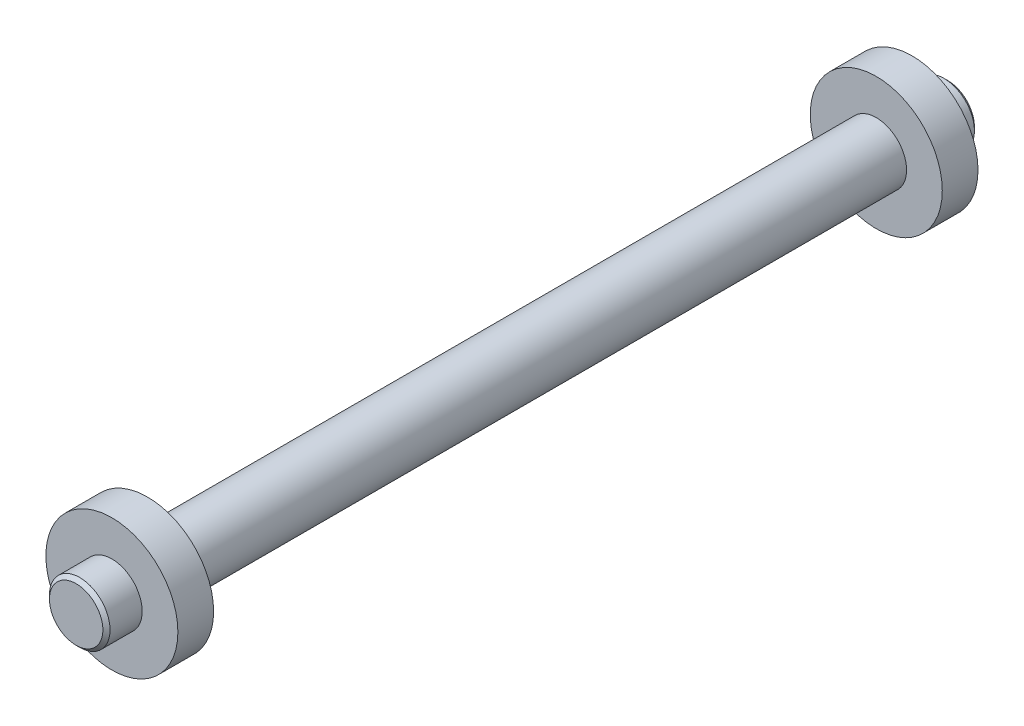
ISO-10303-21;
HEADER;
FILE_DESCRIPTION(('STEP AP214'),'2;1');
FILE_NAME('part.step','',(''),(''),'','','');
FILE_SCHEMA(('AUTOMOTIVE_DESIGN { 1 0 10303 214 1 1 1 1 }'));
ENDSEC;
DATA;
#1=APPLICATION_CONTEXT('core data for automotive mechanical design processes');
#2=APPLICATION_PROTOCOL_DEFINITION('international standard','automotive_design',2000,#1);
#3=PRODUCT_CONTEXT('',#1,'mechanical');
#4=PRODUCT('Part','Part','',(#3));
#5=PRODUCT_RELATED_PRODUCT_CATEGORY('part','',(#4));
#6=PRODUCT_DEFINITION_FORMATION('','',#4);
#7=PRODUCT_DEFINITION_CONTEXT('part definition',#1,'design');
#8=PRODUCT_DEFINITION('design','',#6,#7);
#9=PRODUCT_DEFINITION_SHAPE('','',#8);
#10=(LENGTH_UNIT() NAMED_UNIT(*) SI_UNIT(.MILLI.,.METRE.));
#11=(NAMED_UNIT(*) PLANE_ANGLE_UNIT() SI_UNIT($,.RADIAN.));
#12=(NAMED_UNIT(*) SI_UNIT($,.STERADIAN.) SOLID_ANGLE_UNIT());
#13=UNCERTAINTY_MEASURE_WITH_UNIT(LENGTH_MEASURE(1.E-05),#10,'distance_accuracy_value','');
#14=(GEOMETRIC_REPRESENTATION_CONTEXT(3) GLOBAL_UNCERTAINTY_ASSIGNED_CONTEXT((#13)) GLOBAL_UNIT_ASSIGNED_CONTEXT((#10,
#11,#12)) REPRESENTATION_CONTEXT('',''));
#15=CARTESIAN_POINT('',(0.,0.,0.));
#16=DIRECTION('',(0.,0.,1.));
#17=DIRECTION('',(1.,0.,0.));
#18=AXIS2_PLACEMENT_3D('',#15,#16,#17);
#19=CARTESIAN_POINT('',(0.,1.06,15.25));
#20=DIRECTION('',(0.,0.,-1.));
#21=DIRECTION('',(-1.,0.,0.));
#22=AXIS2_PLACEMENT_3D('',#19,#20,#21);
#23=PLANE('',#22);
#24=CARTESIAN_POINT('',(0.,0.,15.25));
#25=DIRECTION('',(0.,0.,-1.));
#26=DIRECTION('',(-1.,0.,0.));
#27=AXIS2_PLACEMENT_3D('',#24,#25,#26);
#28=CIRCLE('',#27,0.934999999999998);
#29=CARTESIAN_POINT('',(-0.934999999999998,0.,15.25));
#30=VERTEX_POINT('',#29);
#31=EDGE_CURVE('E36',#30,#30,#28,.F.);
#32=ORIENTED_EDGE('',*,*,#31,.T.);
#33=EDGE_LOOP('',(#32));
#34=FACE_BOUND('',#33,.T.);
#35=ADVANCED_FACE('F29',(#34),#23,.F.);
#36=CARTESIAN_POINT('',(0.,0.,-15.25));
#37=DIRECTION('',(0.,0.,1.));
#38=DIRECTION('',(1.,0.,0.));
#39=AXIS2_PLACEMENT_3D('',#36,#37,#38);
#40=PLANE('',#39);
#41=CARTESIAN_POINT('',(0.,0.,-15.25));
#42=DIRECTION('',(0.,0.,1.));
#43=DIRECTION('',(1.,0.,0.));
#44=AXIS2_PLACEMENT_3D('',#41,#42,#43);
#45=CIRCLE('',#44,0.934999999999995);
#46=CARTESIAN_POINT('',(0.934999999999995,0.,-15.25));
#47=VERTEX_POINT('',#46);
#48=EDGE_CURVE('E40',#47,#47,#45,.F.);
#49=ORIENTED_EDGE('',*,*,#48,.T.);
#50=EDGE_LOOP('',(#49));
#51=FACE_BOUND('',#50,.T.);
#52=ADVANCED_FACE('F120',(#51),#40,.F.);
#53=CARTESIAN_POINT('',(0.,0.,15.25));
#54=DIRECTION('',(0.,0.,1.));
#55=DIRECTION('',(1.,0.,0.));
#56=AXIS2_PLACEMENT_3D('',#53,#54,#55);
#57=CYLINDRICAL_SURFACE('',#56,1.06);
#58=CARTESIAN_POINT('',(0.,0.,-15.125));
#59=DIRECTION('',(0.,0.,1.));
#60=DIRECTION('',(1.,0.,0.));
#61=AXIS2_PLACEMENT_3D('',#58,#59,#60);
#62=CIRCLE('',#61,1.06);
#63=CARTESIAN_POINT('',(1.06,0.,-15.125));
#64=VERTEX_POINT('',#63);
#65=EDGE_CURVE('E44',#64,#64,#62,.T.);
#66=ORIENTED_EDGE('',*,*,#65,.T.);
#67=EDGE_LOOP('',(#66));
#68=FACE_BOUND('',#67,.T.);
#69=CARTESIAN_POINT('',(0.,0.,-14.));
#70=DIRECTION('',(0.,0.,1.));
#71=DIRECTION('',(1.,0.,0.));
#72=AXIS2_PLACEMENT_3D('',#69,#70,#71);
#73=CIRCLE('',#72,1.06);
#74=CARTESIAN_POINT('',(1.06,0.,-14.));
#75=VERTEX_POINT('',#74);
#76=EDGE_CURVE('E49',#75,#75,#73,.T.);
#77=ORIENTED_EDGE('',*,*,#76,.F.);
#78=EDGE_LOOP('',(#77));
#79=FACE_BOUND('',#78,.T.);
#80=ADVANCED_FACE('F115',(#68,#79),#57,.T.);
#81=CARTESIAN_POINT('',(0.,1.06,-14.));
#82=DIRECTION('',(0.,0.,1.));
#83=DIRECTION('',(1.,0.,0.));
#84=AXIS2_PLACEMENT_3D('',#81,#82,#83);
#85=PLANE('',#84);
#86=CARTESIAN_POINT('',(0.,0.,-14.));
#87=DIRECTION('',(0.,0.,1.));
#88=DIRECTION('',(1.,0.,0.));
#89=AXIS2_PLACEMENT_3D('',#86,#87,#88);
#90=CIRCLE('',#89,2.31);
#91=CARTESIAN_POINT('',(2.31,0.,-14.));
#92=VERTEX_POINT('',#91);
#93=EDGE_CURVE('E52',#92,#92,#90,.T.);
#94=ORIENTED_EDGE('',*,*,#93,.F.);
#95=EDGE_LOOP('',(#94));
#96=FACE_BOUND('',#95,.T.);
#97=ORIENTED_EDGE('',*,*,#76,.T.);
#98=EDGE_LOOP('',(#97));
#99=FACE_BOUND('',#98,.T.);
#100=ADVANCED_FACE('F109',(#96,#99),#85,.F.);
#101=CARTESIAN_POINT('',(0.,0.,15.25));
#102=DIRECTION('',(0.,0.,1.));
#103=DIRECTION('',(1.,0.,0.));
#104=AXIS2_PLACEMENT_3D('',#101,#102,#103);
#105=CYLINDRICAL_SURFACE('',#104,2.31);
#106=CARTESIAN_POINT('',(0.,0.,-12.75));
#107=DIRECTION('',(0.,0.,1.));
#108=DIRECTION('',(1.,0.,0.));
#109=AXIS2_PLACEMENT_3D('',#106,#107,#108);
#110=CIRCLE('',#109,2.31);
#111=CARTESIAN_POINT('',(2.31,0.,-12.75));
#112=VERTEX_POINT('',#111);
#113=EDGE_CURVE('E55',#112,#112,#110,.T.);
#114=ORIENTED_EDGE('',*,*,#113,.F.);
#115=EDGE_LOOP('',(#114));
#116=FACE_BOUND('',#115,.T.);
#117=ORIENTED_EDGE('',*,*,#93,.T.);
#118=EDGE_LOOP('',(#117));
#119=FACE_BOUND('',#118,.T.);
#120=ADVANCED_FACE('F103',(#116,#119),#105,.T.);
#121=CARTESIAN_POINT('',(0.,2.30999999999999,-12.75));
#122=DIRECTION('',(0.,0.,-1.));
#123=DIRECTION('',(-1.,0.,0.));
#124=AXIS2_PLACEMENT_3D('',#121,#122,#123);
#125=PLANE('',#124);
#126=CARTESIAN_POINT('',(0.,0.,-12.75));
#127=DIRECTION('',(0.,0.,1.));
#128=DIRECTION('',(1.,0.,0.));
#129=AXIS2_PLACEMENT_3D('',#126,#127,#128);
#130=CIRCLE('',#129,1.06);
#131=CARTESIAN_POINT('',(1.06,0.,-12.75));
#132=VERTEX_POINT('',#131);
#133=EDGE_CURVE('E58',#132,#132,#130,.T.);
#134=ORIENTED_EDGE('',*,*,#133,.F.);
#135=EDGE_LOOP('',(#134));
#136=FACE_BOUND('',#135,.T.);
#137=ORIENTED_EDGE('',*,*,#113,.T.);
#138=EDGE_LOOP('',(#137));
#139=FACE_BOUND('',#138,.T.);
#140=ADVANCED_FACE('F97',(#136,#139),#125,.F.);
#141=CARTESIAN_POINT('',(0.,0.,15.25));
#142=DIRECTION('',(0.,0.,1.));
#143=DIRECTION('',(1.,0.,0.));
#144=AXIS2_PLACEMENT_3D('',#141,#142,#143);
#145=CYLINDRICAL_SURFACE('',#144,1.06);
#146=CARTESIAN_POINT('',(0.,0.,12.75));
#147=DIRECTION('',(0.,0.,1.));
#148=DIRECTION('',(1.,0.,0.));
#149=AXIS2_PLACEMENT_3D('',#146,#147,#148);
#150=CIRCLE('',#149,1.06);
#151=CARTESIAN_POINT('',(1.06,0.,12.75));
#152=VERTEX_POINT('',#151);
#153=EDGE_CURVE('E61',#152,#152,#150,.T.);
#154=ORIENTED_EDGE('',*,*,#153,.F.);
#155=EDGE_LOOP('',(#154));
#156=FACE_BOUND('',#155,.T.);
#157=ORIENTED_EDGE('',*,*,#133,.T.);
#158=EDGE_LOOP('',(#157));
#159=FACE_BOUND('',#158,.T.);
#160=ADVANCED_FACE('F91',(#156,#159),#145,.T.);
#161=CARTESIAN_POINT('',(0.,1.06,12.75));
#162=DIRECTION('',(0.,0.,1.));
#163=DIRECTION('',(1.,0.,0.));
#164=AXIS2_PLACEMENT_3D('',#161,#162,#163);
#165=PLANE('',#164);
#166=CARTESIAN_POINT('',(0.,0.,12.75));
#167=DIRECTION('',(0.,0.,1.));
#168=DIRECTION('',(1.,0.,0.));
#169=AXIS2_PLACEMENT_3D('',#166,#167,#168);
#170=CIRCLE('',#169,2.31);
#171=CARTESIAN_POINT('',(2.31,0.,12.75));
#172=VERTEX_POINT('',#171);
#173=EDGE_CURVE('E64',#172,#172,#170,.T.);
#174=ORIENTED_EDGE('',*,*,#173,.F.);
#175=EDGE_LOOP('',(#174));
#176=FACE_BOUND('',#175,.T.);
#177=ORIENTED_EDGE('',*,*,#153,.T.);
#178=EDGE_LOOP('',(#177));
#179=FACE_BOUND('',#178,.T.);
#180=ADVANCED_FACE('F85',(#176,#179),#165,.F.);
#181=CARTESIAN_POINT('',(0.,0.,15.25));
#182=DIRECTION('',(0.,0.,1.));
#183=DIRECTION('',(1.,0.,0.));
#184=AXIS2_PLACEMENT_3D('',#181,#182,#183);
#185=CYLINDRICAL_SURFACE('',#184,2.31);
#186=CARTESIAN_POINT('',(0.,0.,14.));
#187=DIRECTION('',(0.,0.,1.));
#188=DIRECTION('',(1.,0.,0.));
#189=AXIS2_PLACEMENT_3D('',#186,#187,#188);
#190=CIRCLE('',#189,2.31);
#191=CARTESIAN_POINT('',(2.31,0.,14.));
#192=VERTEX_POINT('',#191);
#193=EDGE_CURVE('E67',#192,#192,#190,.T.);
#194=ORIENTED_EDGE('',*,*,#193,.F.);
#195=EDGE_LOOP('',(#194));
#196=FACE_BOUND('',#195,.T.);
#197=ORIENTED_EDGE('',*,*,#173,.T.);
#198=EDGE_LOOP('',(#197));
#199=FACE_BOUND('',#198,.T.);
#200=ADVANCED_FACE('F79',(#196,#199),#185,.T.);
#201=CARTESIAN_POINT('',(0.,2.31,14.));
#202=DIRECTION('',(0.,0.,-1.));
#203=DIRECTION('',(-1.,0.,0.));
#204=AXIS2_PLACEMENT_3D('',#201,#202,#203);
#205=PLANE('',#204);
#206=CARTESIAN_POINT('',(0.,0.,14.));
#207=DIRECTION('',(0.,0.,1.));
#208=DIRECTION('',(1.,0.,0.));
#209=AXIS2_PLACEMENT_3D('',#206,#207,#208);
#210=CIRCLE('',#209,1.06);
#211=CARTESIAN_POINT('',(1.06,0.,14.));
#212=VERTEX_POINT('',#211);
#213=EDGE_CURVE('E70',#212,#212,#210,.T.);
#214=ORIENTED_EDGE('',*,*,#213,.F.);
#215=EDGE_LOOP('',(#214));
#216=FACE_BOUND('',#215,.T.);
#217=ORIENTED_EDGE('',*,*,#193,.T.);
#218=EDGE_LOOP('',(#217));
#219=FACE_BOUND('',#218,.T.);
#220=ADVANCED_FACE('F76',(#216,#219),#205,.F.);
#221=CARTESIAN_POINT('',(0.,0.,15.25));
#222=DIRECTION('',(0.,0.,1.));
#223=DIRECTION('',(1.,0.,0.));
#224=AXIS2_PLACEMENT_3D('',#221,#222,#223);
#225=CYLINDRICAL_SURFACE('',#224,1.06);
#226=CARTESIAN_POINT('',(0.,0.,15.125));
#227=DIRECTION('',(0.,0.,-1.));
#228=DIRECTION('',(-1.,0.,0.));
#229=AXIS2_PLACEMENT_3D('',#226,#227,#228);
#230=CIRCLE('',#229,1.06);
#231=CARTESIAN_POINT('',(-1.06,0.,15.125));
#232=VERTEX_POINT('',#231);
#233=EDGE_CURVE('E10',#232,#232,#230,.T.);
#234=ORIENTED_EDGE('',*,*,#233,.T.);
#235=EDGE_LOOP('',(#234));
#236=FACE_BOUND('',#235,.T.);
#237=ORIENTED_EDGE('',*,*,#213,.T.);
#238=EDGE_LOOP('',(#237));
#239=FACE_BOUND('',#238,.T.);
#240=ADVANCED_FACE('F74',(#236,#239),#225,.T.);
#241=CARTESIAN_POINT('',(0.,0.,-15.125));
#242=DIRECTION('',(0.,0.,1.));
#243=DIRECTION('',(1.,0.,0.));
#244=AXIS2_PLACEMENT_3D('',#241,#242,#243);
#245=CONICAL_SURFACE('',#244,1.06,0.785398163397445);
#246=ORIENTED_EDGE('',*,*,#48,.F.);
#247=EDGE_LOOP('',(#246));
#248=FACE_BOUND('',#247,.T.);
#249=ORIENTED_EDGE('',*,*,#65,.F.);
#250=EDGE_LOOP('',(#249));
#251=FACE_BOUND('',#250,.T.);
#252=ADVANCED_FACE('F132',(#248,#251),#245,.T.);
#253=CARTESIAN_POINT('',(0.,0.,15.25));
#254=DIRECTION('',(0.,0.,-1.));
#255=DIRECTION('',(-1.,0.,0.));
#256=AXIS2_PLACEMENT_3D('',#253,#254,#255);
#257=CONICAL_SURFACE('',#256,0.934999999999998,0.785398163397445);
#258=ORIENTED_EDGE('',*,*,#233,.F.);
#259=EDGE_LOOP('',(#258));
#260=FACE_BOUND('',#259,.T.);
#261=ORIENTED_EDGE('',*,*,#31,.F.);
#262=EDGE_LOOP('',(#261));
#263=FACE_BOUND('',#262,.T.);
#264=ADVANCED_FACE('F31',(#260,#263),#257,.T.);
#265=CLOSED_SHELL('',(#35,#52,#80,#100,#120,#140,#160,#180,#200,#220,#240,#252,#264));
#266=MANIFOLD_SOLID_BREP('B2',#265);
#267=ADVANCED_BREP_SHAPE_REPRESENTATION('',(#18,#266),#14);
#268=SHAPE_DEFINITION_REPRESENTATION(#9,#267);
ENDSEC;
END-ISO-10303-21;
